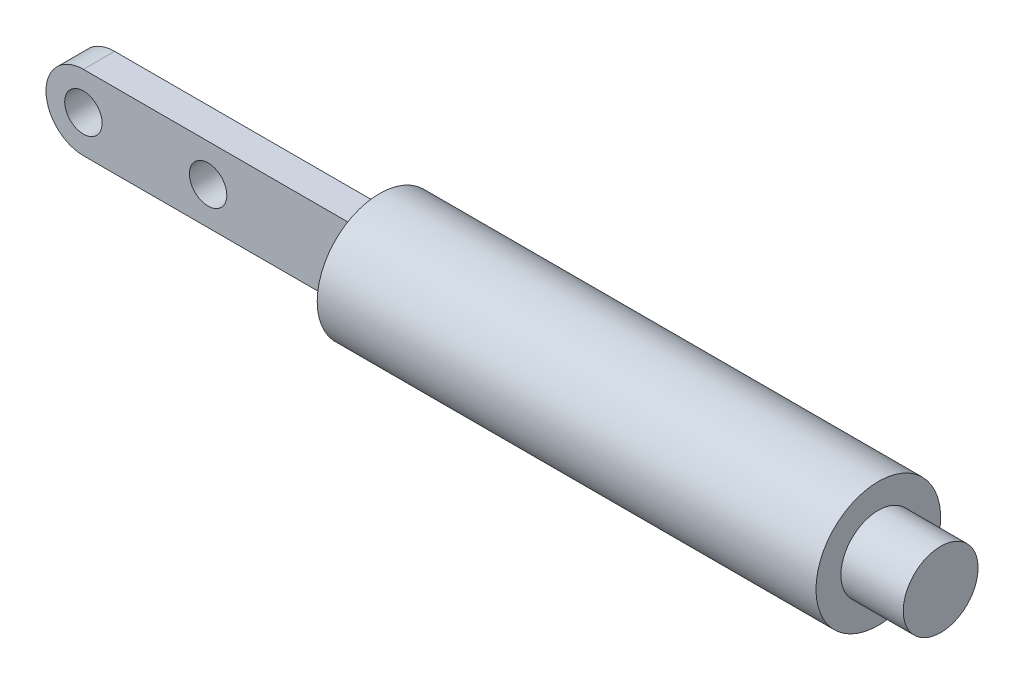
ISO-10303-21;
HEADER;
FILE_DESCRIPTION(('STEP AP214'),'2;1');
FILE_NAME('part.step','',(''),(''),'','','');
FILE_SCHEMA(('AUTOMOTIVE_DESIGN { 1 0 10303 214 1 1 1 1 }'));
ENDSEC;
DATA;
#1=APPLICATION_CONTEXT('core data for automotive mechanical design processes');
#2=APPLICATION_PROTOCOL_DEFINITION('international standard','automotive_design',2000,#1);
#3=PRODUCT_CONTEXT('',#1,'mechanical');
#4=PRODUCT('Part','Part','',(#3));
#5=PRODUCT_RELATED_PRODUCT_CATEGORY('part','',(#4));
#6=PRODUCT_DEFINITION_FORMATION('','',#4);
#7=PRODUCT_DEFINITION_CONTEXT('part definition',#1,'design');
#8=PRODUCT_DEFINITION('design','',#6,#7);
#9=PRODUCT_DEFINITION_SHAPE('','',#8);
#10=(LENGTH_UNIT() NAMED_UNIT(*) SI_UNIT(.MILLI.,.METRE.));
#11=(NAMED_UNIT(*) PLANE_ANGLE_UNIT() SI_UNIT($,.RADIAN.));
#12=(NAMED_UNIT(*) SI_UNIT($,.STERADIAN.) SOLID_ANGLE_UNIT());
#13=UNCERTAINTY_MEASURE_WITH_UNIT(LENGTH_MEASURE(1.E-05),#10,'distance_accuracy_value','');
#14=(GEOMETRIC_REPRESENTATION_CONTEXT(3) GLOBAL_UNCERTAINTY_ASSIGNED_CONTEXT((#13)) GLOBAL_UNIT_ASSIGNED_CONTEXT((#10,
#11,#12)) REPRESENTATION_CONTEXT('',''));
#15=CARTESIAN_POINT('',(0.,0.,0.));
#16=DIRECTION('',(0.,0.,1.));
#17=DIRECTION('',(1.,0.,0.));
#18=AXIS2_PLACEMENT_3D('',#15,#16,#17);
#19=CARTESIAN_POINT('',(0.,0.,0.));
#20=DIRECTION('',(1.,0.,0.));
#21=DIRECTION('',(0.,0.,-1.));
#22=AXIS2_PLACEMENT_3D('',#19,#20,#21);
#23=PLANE('',#22);
#24=CARTESIAN_POINT('',(0.,0.,0.));
#25=DIRECTION('',(-1.,0.,0.));
#26=DIRECTION('',(0.,0.,1.));
#27=AXIS2_PLACEMENT_3D('',#24,#25,#26);
#28=CIRCLE('',#27,10.);
#29=CARTESIAN_POINT('',(0.,0.,10.));
#30=VERTEX_POINT('',#29);
#31=EDGE_CURVE('E11',#30,#30,#28,.T.);
#32=ORIENTED_EDGE('',*,*,#31,.T.);
#33=EDGE_LOOP('',(#32));
#34=FACE_BOUND('',#33,.T.);
#35=DIRECTION('',(0.,-1.,0.));
#36=VECTOR('',#35,1.);
#37=CARTESIAN_POINT('',(0.,0.,-2.5));
#38=LINE('',#37,#36);
#39=CARTESIAN_POINT('',(0.,6.,-2.5));
#40=VERTEX_POINT('',#39);
#41=CARTESIAN_POINT('',(0.,-6.,-2.5));
#42=VERTEX_POINT('',#41);
#43=EDGE_CURVE('E56',#40,#42,#38,.T.);
#44=ORIENTED_EDGE('',*,*,#43,.F.);
#45=DIRECTION('',(0.,0.,-1.));
#46=VECTOR('',#45,1.);
#47=CARTESIAN_POINT('',(0.,6.,2.5));
#48=LINE('',#47,#46);
#49=CARTESIAN_POINT('',(0.,6.,2.5));
#50=VERTEX_POINT('',#49);
#51=EDGE_CURVE('E81',#50,#40,#48,.T.);
#52=ORIENTED_EDGE('',*,*,#51,.F.);
#53=DIRECTION('',(0.,-1.,0.));
#54=VECTOR('',#53,1.);
#55=CARTESIAN_POINT('',(0.,0.,2.5));
#56=LINE('',#55,#54);
#57=CARTESIAN_POINT('',(0.,-6.,2.5));
#58=VERTEX_POINT('',#57);
#59=EDGE_CURVE('E106',#50,#58,#56,.T.);
#60=ORIENTED_EDGE('',*,*,#59,.T.);
#61=DIRECTION('',(0.,0.,-1.));
#62=VECTOR('',#61,1.);
#63=CARTESIAN_POINT('',(0.,-6.,2.5));
#64=LINE('',#63,#62);
#65=EDGE_CURVE('E101',#58,#42,#64,.T.);
#66=ORIENTED_EDGE('',*,*,#65,.T.);
#67=EDGE_LOOP('',(#44,#52,#60,#66));
#68=FACE_BOUND('',#67,.T.);
#69=ADVANCED_FACE('F41',(#34,#68),#23,.F.);
#70=CARTESIAN_POINT('',(0.,0.,0.));
#71=DIRECTION('',(-1.,0.,0.));
#72=DIRECTION('',(0.,0.,1.));
#73=AXIS2_PLACEMENT_3D('',#70,#71,#72);
#74=CYLINDRICAL_SURFACE('',#73,6.);
#75=CARTESIAN_POINT('',(80.,0.,0.));
#76=DIRECTION('',(-1.,0.,0.));
#77=DIRECTION('',(0.,0.,1.));
#78=AXIS2_PLACEMENT_3D('',#75,#76,#77);
#79=CIRCLE('',#78,6.);
#80=CARTESIAN_POINT('',(80.,0.,6.));
#81=VERTEX_POINT('',#80);
#82=EDGE_CURVE('E130',#81,#81,#79,.T.);
#83=ORIENTED_EDGE('',*,*,#82,.F.);
#84=EDGE_LOOP('',(#83));
#85=FACE_BOUND('',#84,.T.);
#86=CARTESIAN_POINT('',(90.,0.,0.));
#87=DIRECTION('',(-1.,0.,0.));
#88=DIRECTION('',(0.,0.,1.));
#89=AXIS2_PLACEMENT_3D('',#86,#87,#88);
#90=CIRCLE('',#89,6.);
#91=CARTESIAN_POINT('',(90.,0.,6.));
#92=VERTEX_POINT('',#91);
#93=EDGE_CURVE('E49',#92,#92,#90,.T.);
#94=ORIENTED_EDGE('',*,*,#93,.T.);
#95=EDGE_LOOP('',(#94));
#96=FACE_BOUND('',#95,.T.);
#97=ADVANCED_FACE('F135',(#85,#96),#74,.T.);
#98=CARTESIAN_POINT('',(80.,0.,0.));
#99=DIRECTION('',(-1.,0.,0.));
#100=DIRECTION('',(0.,0.,1.));
#101=AXIS2_PLACEMENT_3D('',#98,#99,#100);
#102=PLANE('',#101);
#103=CARTESIAN_POINT('',(80.,0.,0.));
#104=DIRECTION('',(-1.,0.,0.));
#105=DIRECTION('',(0.,0.,1.));
#106=AXIS2_PLACEMENT_3D('',#103,#104,#105);
#107=CIRCLE('',#106,10.);
#108=CARTESIAN_POINT('',(80.,0.,10.));
#109=VERTEX_POINT('',#108);
#110=EDGE_CURVE('E127',#109,#109,#107,.T.);
#111=ORIENTED_EDGE('',*,*,#110,.F.);
#112=EDGE_LOOP('',(#111));
#113=FACE_BOUND('',#112,.T.);
#114=ORIENTED_EDGE('',*,*,#82,.T.);
#115=EDGE_LOOP('',(#114));
#116=FACE_BOUND('',#115,.T.);
#117=ADVANCED_FACE('F147',(#113,#116),#102,.F.);
#118=CARTESIAN_POINT('',(0.,0.,0.));
#119=DIRECTION('',(-1.,0.,0.));
#120=DIRECTION('',(0.,0.,1.));
#121=AXIS2_PLACEMENT_3D('',#118,#119,#120);
#122=CYLINDRICAL_SURFACE('',#121,10.);
#123=ORIENTED_EDGE('',*,*,#31,.F.);
#124=EDGE_LOOP('',(#123));
#125=FACE_BOUND('',#124,.T.);
#126=ORIENTED_EDGE('',*,*,#110,.T.);
#127=EDGE_LOOP('',(#126));
#128=FACE_BOUND('',#127,.T.);
#129=ADVANCED_FACE('F43',(#125,#128),#122,.T.);
#130=CARTESIAN_POINT('',(90.,0.,0.));
#131=DIRECTION('',(-1.,0.,0.));
#132=DIRECTION('',(0.,0.,1.));
#133=AXIS2_PLACEMENT_3D('',#130,#131,#132);
#134=PLANE('',#133);
#135=ORIENTED_EDGE('',*,*,#93,.F.);
#136=EDGE_LOOP('',(#135));
#137=FACE_BOUND('',#136,.T.);
#138=ADVANCED_FACE('F137',(#137),#134,.F.);
#139=CARTESIAN_POINT('',(0.,6.,2.5));
#140=DIRECTION('',(0.,-1.,0.));
#141=DIRECTION('',(1.,0.,0.));
#142=AXIS2_PLACEMENT_3D('',#139,#140,#141);
#143=PLANE('',#142);
#144=DIRECTION('',(-1.,0.,0.));
#145=VECTOR('',#144,1.);
#146=CARTESIAN_POINT('',(0.,6.,-2.5));
#147=LINE('',#146,#145);
#148=CARTESIAN_POINT('',(-45.,5.99999999999999,-2.5));
#149=VERTEX_POINT('',#148);
#150=EDGE_CURVE('E117',#40,#149,#147,.T.);
#151=ORIENTED_EDGE('',*,*,#150,.T.);
#152=DIRECTION('',(0.,0.,-1.));
#153=VECTOR('',#152,1.);
#154=CARTESIAN_POINT('',(-45.,5.99999999999999,2.5));
#155=LINE('',#154,#153);
#156=CARTESIAN_POINT('',(-45.,5.99999999999999,2.5));
#157=VERTEX_POINT('',#156);
#158=EDGE_CURVE('E100',#157,#149,#155,.T.);
#159=ORIENTED_EDGE('',*,*,#158,.F.);
#160=DIRECTION('',(-1.,0.,0.));
#161=VECTOR('',#160,1.);
#162=CARTESIAN_POINT('',(0.,6.,2.5));
#163=LINE('',#162,#161);
#164=EDGE_CURVE('E65',#50,#157,#163,.T.);
#165=ORIENTED_EDGE('',*,*,#164,.F.);
#166=ORIENTED_EDGE('',*,*,#51,.T.);
#167=EDGE_LOOP('',(#151,#159,#165,#166));
#168=FACE_BOUND('',#167,.T.);
#169=ADVANCED_FACE('F139',(#168),#143,.F.);
#170=CARTESIAN_POINT('',(-45.,0.,2.5));
#171=DIRECTION('',(0.,0.,-1.));
#172=DIRECTION('',(-1.,0.,0.));
#173=AXIS2_PLACEMENT_3D('',#170,#171,#172);
#174=CYLINDRICAL_SURFACE('',#173,5.99999999999999);
#175=CARTESIAN_POINT('',(-45.,0.,-2.5));
#176=DIRECTION('',(0.,0.,1.));
#177=DIRECTION('',(1.,0.,0.));
#178=AXIS2_PLACEMENT_3D('',#175,#176,#177);
#179=CIRCLE('',#178,5.99999999999999);
#180=CARTESIAN_POINT('',(-45.,-5.99999999999999,-2.5));
#181=VERTEX_POINT('',#180);
#182=EDGE_CURVE('E98',#149,#181,#179,.T.);
#183=ORIENTED_EDGE('',*,*,#182,.T.);
#184=DIRECTION('',(0.,0.,-1.));
#185=VECTOR('',#184,1.);
#186=CARTESIAN_POINT('',(-45.,-5.99999999999999,2.5));
#187=LINE('',#186,#185);
#188=CARTESIAN_POINT('',(-45.,-5.99999999999999,2.5));
#189=VERTEX_POINT('',#188);
#190=EDGE_CURVE('E96',#189,#181,#187,.T.);
#191=ORIENTED_EDGE('',*,*,#190,.F.);
#192=CARTESIAN_POINT('',(-45.,0.,2.5));
#193=DIRECTION('',(0.,0.,1.));
#194=DIRECTION('',(1.,0.,0.));
#195=AXIS2_PLACEMENT_3D('',#192,#193,#194);
#196=CIRCLE('',#195,5.99999999999999);
#197=EDGE_CURVE('E88',#157,#189,#196,.T.);
#198=ORIENTED_EDGE('',*,*,#197,.F.);
#199=ORIENTED_EDGE('',*,*,#158,.T.);
#200=EDGE_LOOP('',(#183,#191,#198,#199));
#201=FACE_BOUND('',#200,.T.);
#202=ADVANCED_FACE('F97',(#201),#174,.T.);
#203=CARTESIAN_POINT('',(0.,-6.,2.5));
#204=DIRECTION('',(0.,1.,0.));
#205=DIRECTION('',(-1.,0.,0.));
#206=AXIS2_PLACEMENT_3D('',#203,#204,#205);
#207=PLANE('',#206);
#208=DIRECTION('',(1.,0.,0.));
#209=VECTOR('',#208,1.);
#210=CARTESIAN_POINT('',(0.,-6.,-2.5));
#211=LINE('',#210,#209);
#212=EDGE_CURVE('E120',#181,#42,#211,.T.);
#213=ORIENTED_EDGE('',*,*,#212,.T.);
#214=ORIENTED_EDGE('',*,*,#65,.F.);
#215=DIRECTION('',(1.,0.,0.));
#216=VECTOR('',#215,1.);
#217=CARTESIAN_POINT('',(0.,-6.,2.5));
#218=LINE('',#217,#216);
#219=EDGE_CURVE('E92',#189,#58,#218,.T.);
#220=ORIENTED_EDGE('',*,*,#219,.F.);
#221=ORIENTED_EDGE('',*,*,#190,.T.);
#222=EDGE_LOOP('',(#213,#214,#220,#221));
#223=FACE_BOUND('',#222,.T.);
#224=ADVANCED_FACE('F103',(#223),#207,.F.);
#225=CARTESIAN_POINT('',(-45.,0.,2.5));
#226=DIRECTION('',(0.,0.,-1.));
#227=DIRECTION('',(-1.,0.,0.));
#228=AXIS2_PLACEMENT_3D('',#225,#226,#227);
#229=CYLINDRICAL_SURFACE('',#228,3.);
#230=CARTESIAN_POINT('',(-45.,0.,2.5));
#231=DIRECTION('',(0.,0.,1.));
#232=DIRECTION('',(1.,0.,0.));
#233=AXIS2_PLACEMENT_3D('',#230,#231,#232);
#234=CIRCLE('',#233,3.);
#235=CARTESIAN_POINT('',(-42.,0.,2.5));
#236=VERTEX_POINT('',#235);
#237=EDGE_CURVE('E189',#236,#236,#234,.T.);
#238=ORIENTED_EDGE('',*,*,#237,.T.);
#239=EDGE_LOOP('',(#238));
#240=FACE_BOUND('',#239,.T.);
#241=CARTESIAN_POINT('',(-45.,0.,-2.5));
#242=DIRECTION('',(0.,0.,1.));
#243=DIRECTION('',(1.,0.,0.));
#244=AXIS2_PLACEMENT_3D('',#241,#242,#243);
#245=CIRCLE('',#244,3.);
#246=CARTESIAN_POINT('',(-42.,0.,-2.5));
#247=VERTEX_POINT('',#246);
#248=EDGE_CURVE('E114',#247,#247,#245,.T.);
#249=ORIENTED_EDGE('',*,*,#248,.F.);
#250=EDGE_LOOP('',(#249));
#251=FACE_BOUND('',#250,.T.);
#252=ADVANCED_FACE('F167',(#240,#251),#229,.F.);
#253=CARTESIAN_POINT('',(-25.,0.,2.5));
#254=DIRECTION('',(0.,0.,-1.));
#255=DIRECTION('',(-1.,0.,0.));
#256=AXIS2_PLACEMENT_3D('',#253,#254,#255);
#257=CYLINDRICAL_SURFACE('',#256,3.);
#258=CARTESIAN_POINT('',(-25.,0.,2.5));
#259=DIRECTION('',(0.,0.,1.));
#260=DIRECTION('',(1.,0.,0.));
#261=AXIS2_PLACEMENT_3D('',#258,#259,#260);
#262=CIRCLE('',#261,3.);
#263=CARTESIAN_POINT('',(-22.,0.,2.5));
#264=VERTEX_POINT('',#263);
#265=EDGE_CURVE('E123',#264,#264,#262,.T.);
#266=ORIENTED_EDGE('',*,*,#265,.T.);
#267=EDGE_LOOP('',(#266));
#268=FACE_BOUND('',#267,.T.);
#269=CARTESIAN_POINT('',(-25.,0.,-2.5));
#270=DIRECTION('',(0.,0.,1.));
#271=DIRECTION('',(1.,0.,0.));
#272=AXIS2_PLACEMENT_3D('',#269,#270,#271);
#273=CIRCLE('',#272,3.);
#274=CARTESIAN_POINT('',(-22.,0.,-2.5));
#275=VERTEX_POINT('',#274);
#276=EDGE_CURVE('E111',#275,#275,#273,.T.);
#277=ORIENTED_EDGE('',*,*,#276,.F.);
#278=EDGE_LOOP('',(#277));
#279=FACE_BOUND('',#278,.T.);
#280=ADVANCED_FACE('F164',(#268,#279),#257,.F.);
#281=CARTESIAN_POINT('',(0.,0.,2.5));
#282=DIRECTION('',(0.,0.,1.));
#283=DIRECTION('',(1.,0.,0.));
#284=AXIS2_PLACEMENT_3D('',#281,#282,#283);
#285=PLANE('',#284);
#286=ORIENTED_EDGE('',*,*,#265,.F.);
#287=EDGE_LOOP('',(#286));
#288=FACE_BOUND('',#287,.T.);
#289=ORIENTED_EDGE('',*,*,#237,.F.);
#290=EDGE_LOOP('',(#289));
#291=FACE_BOUND('',#290,.T.);
#292=ORIENTED_EDGE('',*,*,#164,.T.);
#293=ORIENTED_EDGE('',*,*,#197,.T.);
#294=ORIENTED_EDGE('',*,*,#219,.T.);
#295=ORIENTED_EDGE('',*,*,#59,.F.);
#296=EDGE_LOOP('',(#292,#293,#294,#295));
#297=FACE_BOUND('',#296,.T.);
#298=ADVANCED_FACE('F90',(#288,#291,#297),#285,.T.);
#299=CARTESIAN_POINT('',(0.,0.,-2.5));
#300=DIRECTION('',(0.,0.,1.));
#301=DIRECTION('',(1.,0.,0.));
#302=AXIS2_PLACEMENT_3D('',#299,#300,#301);
#303=PLANE('',#302);
#304=ORIENTED_EDGE('',*,*,#276,.T.);
#305=EDGE_LOOP('',(#304));
#306=FACE_BOUND('',#305,.T.);
#307=ORIENTED_EDGE('',*,*,#248,.T.);
#308=EDGE_LOOP('',(#307));
#309=FACE_BOUND('',#308,.T.);
#310=ORIENTED_EDGE('',*,*,#150,.F.);
#311=ORIENTED_EDGE('',*,*,#43,.T.);
#312=ORIENTED_EDGE('',*,*,#212,.F.);
#313=ORIENTED_EDGE('',*,*,#182,.F.);
#314=EDGE_LOOP('',(#310,#311,#312,#313));
#315=FACE_BOUND('',#314,.T.);
#316=ADVANCED_FACE('F176',(#306,#309,#315),#303,.F.);
#317=CLOSED_SHELL('',(#69,#97,#117,#129,#138,#169,#202,#224,#252,#280,#298,#316));
#318=MANIFOLD_SOLID_BREP('B2',#317);
#319=ADVANCED_BREP_SHAPE_REPRESENTATION('',(#18,#318),#14);
#320=SHAPE_DEFINITION_REPRESENTATION(#9,#319);
ENDSEC;
END-ISO-10303-21;
